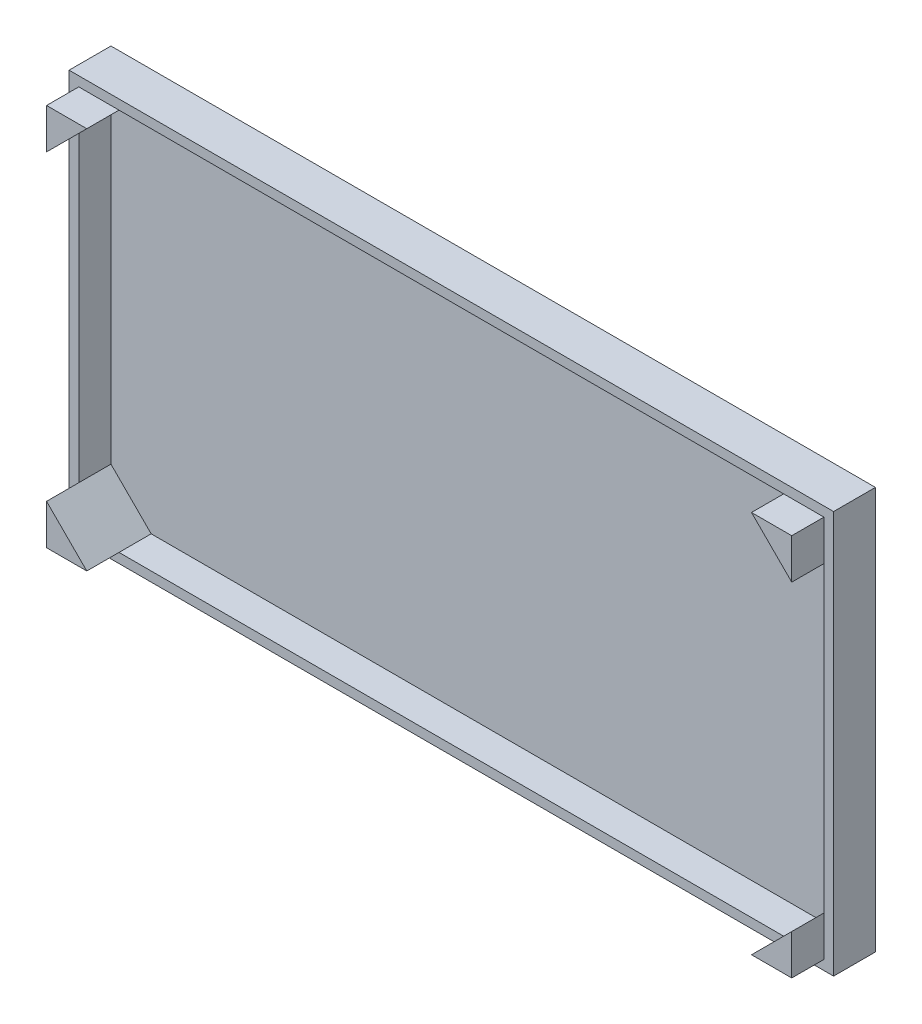
ISO-10303-21;
HEADER;
FILE_DESCRIPTION(('STEP AP214'),'2;1');
FILE_NAME('part.step','',(''),(''),'','','');
FILE_SCHEMA(('AUTOMOTIVE_DESIGN { 1 0 10303 214 1 1 1 1 }'));
ENDSEC;
DATA;
#1=APPLICATION_CONTEXT('core data for automotive mechanical design processes');
#2=APPLICATION_PROTOCOL_DEFINITION('international standard','automotive_design',2000,#1);
#3=PRODUCT_CONTEXT('',#1,'mechanical');
#4=PRODUCT('Part','Part','',(#3));
#5=PRODUCT_RELATED_PRODUCT_CATEGORY('part','',(#4));
#6=PRODUCT_DEFINITION_FORMATION('','',#4);
#7=PRODUCT_DEFINITION_CONTEXT('part definition',#1,'design');
#8=PRODUCT_DEFINITION('design','',#6,#7);
#9=PRODUCT_DEFINITION_SHAPE('','',#8);
#10=(LENGTH_UNIT() NAMED_UNIT(*) SI_UNIT(.MILLI.,.METRE.));
#11=(NAMED_UNIT(*) PLANE_ANGLE_UNIT() SI_UNIT($,.RADIAN.));
#12=(NAMED_UNIT(*) SI_UNIT($,.STERADIAN.) SOLID_ANGLE_UNIT());
#13=UNCERTAINTY_MEASURE_WITH_UNIT(LENGTH_MEASURE(1.E-05),#10,'distance_accuracy_value','');
#14=(GEOMETRIC_REPRESENTATION_CONTEXT(3) GLOBAL_UNCERTAINTY_ASSIGNED_CONTEXT((#13)) GLOBAL_UNIT_ASSIGNED_CONTEXT((#10,
#11,#12)) REPRESENTATION_CONTEXT('',''));
#15=CARTESIAN_POINT('',(0.,0.,0.));
#16=DIRECTION('',(0.,0.,1.));
#17=DIRECTION('',(1.,0.,0.));
#18=AXIS2_PLACEMENT_3D('',#15,#16,#17);
#19=CARTESIAN_POINT('',(0.,0.,1.2));
#20=DIRECTION('',(0.,0.,-1.));
#21=DIRECTION('',(-1.,0.,0.));
#22=AXIS2_PLACEMENT_3D('',#19,#20,#21);
#23=PLANE('',#22);
#24=DIRECTION('',(-0.707106781186548,0.707106781186547,0.));
#25=VECTOR('',#24,1.);
#26=CARTESIAN_POINT('',(1.2,6.2,1.2));
#27=LINE('',#26,#25);
#28=CARTESIAN_POINT('',(6.20000000000001,1.2,1.2));
#29=VERTEX_POINT('',#28);
#30=CARTESIAN_POINT('',(1.20000000000001,6.2,1.2));
#31=VERTEX_POINT('',#30);
#32=EDGE_CURVE('E48',#29,#31,#27,.T.);
#33=ORIENTED_EDGE('',*,*,#32,.F.);
#34=DIRECTION('',(1.,0.,0.));
#35=VECTOR('',#34,1.);
#36=CARTESIAN_POINT('',(1.20000000000001,1.2,1.2));
#37=LINE('',#36,#35);
#38=CARTESIAN_POINT('',(88.8,1.2,1.2));
#39=VERTEX_POINT('',#38);
#40=EDGE_CURVE('E281',#29,#39,#37,.T.);
#41=ORIENTED_EDGE('',*,*,#40,.T.);
#42=DIRECTION('',(-0.707106781186548,-0.707106781186547,0.));
#43=VECTOR('',#42,1.);
#44=CARTESIAN_POINT('',(88.8,1.2,1.2));
#45=LINE('',#44,#43);
#46=CARTESIAN_POINT('',(93.8,6.2,1.2));
#47=VERTEX_POINT('',#46);
#48=EDGE_CURVE('E194',#47,#39,#45,.T.);
#49=ORIENTED_EDGE('',*,*,#48,.F.);
#50=DIRECTION('',(0.,1.,0.));
#51=VECTOR('',#50,1.);
#52=CARTESIAN_POINT('',(93.8,48.8,1.2));
#53=LINE('',#52,#51);
#54=CARTESIAN_POINT('',(93.8,43.8,1.2));
#55=VERTEX_POINT('',#54);
#56=EDGE_CURVE('E283',#47,#55,#53,.T.);
#57=ORIENTED_EDGE('',*,*,#56,.T.);
#58=DIRECTION('',(0.707106781186548,-0.707106781186547,0.));
#59=VECTOR('',#58,1.);
#60=CARTESIAN_POINT('',(93.8,43.8,1.2));
#61=LINE('',#60,#59);
#62=CARTESIAN_POINT('',(88.8,48.8,1.2));
#63=VERTEX_POINT('',#62);
#64=EDGE_CURVE('E219',#63,#55,#61,.T.);
#65=ORIENTED_EDGE('',*,*,#64,.F.);
#66=DIRECTION('',(-1.,0.,0.));
#67=VECTOR('',#66,1.);
#68=CARTESIAN_POINT('',(1.2,48.8,1.2));
#69=LINE('',#68,#67);
#70=CARTESIAN_POINT('',(6.2,48.8,1.2));
#71=VERTEX_POINT('',#70);
#72=EDGE_CURVE('E285',#63,#71,#69,.T.);
#73=ORIENTED_EDGE('',*,*,#72,.T.);
#74=DIRECTION('',(0.707106781186548,0.707106781186547,0.));
#75=VECTOR('',#74,1.);
#76=CARTESIAN_POINT('',(6.2,48.8,1.2));
#77=LINE('',#76,#75);
#78=CARTESIAN_POINT('',(1.20000000000001,43.8,1.2));
#79=VERTEX_POINT('',#78);
#80=EDGE_CURVE('E239',#79,#71,#77,.T.);
#81=ORIENTED_EDGE('',*,*,#80,.F.);
#82=DIRECTION('',(0.,-1.,0.));
#83=VECTOR('',#82,1.);
#84=CARTESIAN_POINT('',(1.2,48.8,1.2));
#85=LINE('',#84,#83);
#86=EDGE_CURVE('E263',#79,#31,#85,.T.);
#87=ORIENTED_EDGE('',*,*,#86,.T.);
#88=EDGE_LOOP('',(#33,#41,#49,#57,#65,#73,#81,#87));
#89=FACE_BOUND('',#88,.T.);
#90=ADVANCED_FACE('F33',(#89),#23,.F.);
#91=CARTESIAN_POINT('',(1.20000000000001,1.2,5.2));
#92=DIRECTION('',(0.,1.,0.));
#93=DIRECTION('',(0.,0.,1.));
#94=AXIS2_PLACEMENT_3D('',#91,#92,#93);
#95=PLANE('',#94);
#96=ORIENTED_EDGE('',*,*,#40,.F.);
#97=DIRECTION('',(0.,0.,-1.));
#98=VECTOR('',#97,1.);
#99=CARTESIAN_POINT('',(6.20000000000001,1.2,9.2));
#100=LINE('',#99,#98);
#101=CARTESIAN_POINT('',(6.2,1.2,5.2));
#102=VERTEX_POINT('',#101);
#103=EDGE_CURVE('E195',#102,#29,#100,.T.);
#104=ORIENTED_EDGE('',*,*,#103,.F.);
#105=DIRECTION('',(1.,0.,0.));
#106=VECTOR('',#105,1.);
#107=CARTESIAN_POINT('',(1.20000000000001,1.2,5.2));
#108=LINE('',#107,#106);
#109=CARTESIAN_POINT('',(88.8,1.2,5.2));
#110=VERTEX_POINT('',#109);
#111=EDGE_CURVE('E272',#102,#110,#108,.T.);
#112=ORIENTED_EDGE('',*,*,#111,.T.);
#113=DIRECTION('',(0.,0.,-1.));
#114=VECTOR('',#113,1.);
#115=CARTESIAN_POINT('',(88.8,1.2,5.2));
#116=LINE('',#115,#114);
#117=EDGE_CURVE('E11',#110,#39,#116,.T.);
#118=ORIENTED_EDGE('',*,*,#117,.T.);
#119=EDGE_LOOP('',(#96,#104,#112,#118));
#120=FACE_BOUND('',#119,.T.);
#121=ADVANCED_FACE('F355',(#120),#95,.T.);
#122=CARTESIAN_POINT('',(1.2,48.8,5.2));
#123=DIRECTION('',(1.,0.,0.));
#124=DIRECTION('',(0.,1.,0.));
#125=AXIS2_PLACEMENT_3D('',#122,#123,#124);
#126=PLANE('',#125);
#127=DIRECTION('',(0.,-1.,0.));
#128=VECTOR('',#127,1.);
#129=CARTESIAN_POINT('',(1.2,48.8,5.2));
#130=LINE('',#129,#128);
#131=CARTESIAN_POINT('',(1.2,43.8,5.2));
#132=VERTEX_POINT('',#131);
#133=CARTESIAN_POINT('',(1.20000000000001,6.2,5.2));
#134=VERTEX_POINT('',#133);
#135=EDGE_CURVE('E268',#132,#134,#130,.T.);
#136=ORIENTED_EDGE('',*,*,#135,.T.);
#137=DIRECTION('',(0.,0.,-1.));
#138=VECTOR('',#137,1.);
#139=CARTESIAN_POINT('',(1.2,6.2,9.2));
#140=LINE('',#139,#138);
#141=EDGE_CURVE('E56',#134,#31,#140,.T.);
#142=ORIENTED_EDGE('',*,*,#141,.T.);
#143=ORIENTED_EDGE('',*,*,#86,.F.);
#144=DIRECTION('',(0.,0.,-1.));
#145=VECTOR('',#144,1.);
#146=CARTESIAN_POINT('',(1.2,43.8,9.2));
#147=LINE('',#146,#145);
#148=EDGE_CURVE('E256',#132,#79,#147,.T.);
#149=ORIENTED_EDGE('',*,*,#148,.F.);
#150=EDGE_LOOP('',(#136,#142,#143,#149));
#151=FACE_BOUND('',#150,.T.);
#152=ADVANCED_FACE('F381',(#151),#126,.T.);
#153=CARTESIAN_POINT('',(93.8,48.8,5.2));
#154=DIRECTION('',(-1.,0.,0.));
#155=DIRECTION('',(0.,0.,1.));
#156=AXIS2_PLACEMENT_3D('',#153,#154,#155);
#157=PLANE('',#156);
#158=ORIENTED_EDGE('',*,*,#56,.F.);
#159=DIRECTION('',(0.,0.,-1.));
#160=VECTOR('',#159,1.);
#161=CARTESIAN_POINT('',(93.8,6.2,9.2));
#162=LINE('',#161,#160);
#163=CARTESIAN_POINT('',(93.8,6.2,5.2));
#164=VERTEX_POINT('',#163);
#165=EDGE_CURVE('E215',#164,#47,#162,.T.);
#166=ORIENTED_EDGE('',*,*,#165,.F.);
#167=DIRECTION('',(0.,1.,0.));
#168=VECTOR('',#167,1.);
#169=CARTESIAN_POINT('',(93.8,48.8,5.2));
#170=LINE('',#169,#168);
#171=CARTESIAN_POINT('',(93.8,43.8,5.2));
#172=VERTEX_POINT('',#171);
#173=EDGE_CURVE('E276',#164,#172,#170,.T.);
#174=ORIENTED_EDGE('',*,*,#173,.T.);
#175=DIRECTION('',(0.,0.,-1.));
#176=VECTOR('',#175,1.);
#177=CARTESIAN_POINT('',(93.8,43.8,5.2));
#178=LINE('',#177,#176);
#179=EDGE_CURVE('E41',#172,#55,#178,.T.);
#180=ORIENTED_EDGE('',*,*,#179,.T.);
#181=EDGE_LOOP('',(#158,#166,#174,#180));
#182=FACE_BOUND('',#181,.T.);
#183=ADVANCED_FACE('F322',(#182),#157,.T.);
#184=CARTESIAN_POINT('',(1.2,48.8,5.2));
#185=DIRECTION('',(0.,-1.,0.));
#186=DIRECTION('',(0.,0.,-1.));
#187=AXIS2_PLACEMENT_3D('',#184,#185,#186);
#188=PLANE('',#187);
#189=ORIENTED_EDGE('',*,*,#72,.F.);
#190=DIRECTION('',(0.,0.,-1.));
#191=VECTOR('',#190,1.);
#192=CARTESIAN_POINT('',(88.8,48.8,9.2));
#193=LINE('',#192,#191);
#194=CARTESIAN_POINT('',(88.8,48.8,5.2));
#195=VERTEX_POINT('',#194);
#196=EDGE_CURVE('E235',#195,#63,#193,.T.);
#197=ORIENTED_EDGE('',*,*,#196,.F.);
#198=DIRECTION('',(-1.,0.,0.));
#199=VECTOR('',#198,1.);
#200=CARTESIAN_POINT('',(1.2,48.8,5.2));
#201=LINE('',#200,#199);
#202=CARTESIAN_POINT('',(6.2,48.8,5.2));
#203=VERTEX_POINT('',#202);
#204=EDGE_CURVE('E275',#195,#203,#201,.T.);
#205=ORIENTED_EDGE('',*,*,#204,.T.);
#206=DIRECTION('',(0.,0.,-1.));
#207=VECTOR('',#206,1.);
#208=CARTESIAN_POINT('',(6.2,48.8,9.2));
#209=LINE('',#208,#207);
#210=EDGE_CURVE('E252',#203,#71,#209,.T.);
#211=ORIENTED_EDGE('',*,*,#210,.T.);
#212=EDGE_LOOP('',(#189,#197,#205,#211));
#213=FACE_BOUND('',#212,.T.);
#214=ADVANCED_FACE('F346',(#213),#188,.T.);
#215=CARTESIAN_POINT('',(0.,0.,1.2));
#216=DIRECTION('',(1.,0.,0.));
#217=DIRECTION('',(0.,0.,-1.));
#218=AXIS2_PLACEMENT_3D('',#215,#216,#217);
#219=PLANE('',#218);
#220=DIRECTION('',(0.,-1.,0.));
#221=VECTOR('',#220,1.);
#222=CARTESIAN_POINT('',(0.,0.,0.));
#223=LINE('',#222,#221);
#224=CARTESIAN_POINT('',(0.,50.,0.));
#225=VERTEX_POINT('',#224);
#226=CARTESIAN_POINT('',(0.,0.,0.));
#227=VERTEX_POINT('',#226);
#228=EDGE_CURVE('E298',#225,#227,#223,.T.);
#229=ORIENTED_EDGE('',*,*,#228,.T.);
#230=DIRECTION('',(0.,0.,-1.));
#231=VECTOR('',#230,1.);
#232=CARTESIAN_POINT('',(0.,0.,1.2));
#233=LINE('',#232,#231);
#234=CARTESIAN_POINT('',(0.,0.,5.2));
#235=VERTEX_POINT('',#234);
#236=EDGE_CURVE('E316',#235,#227,#233,.T.);
#237=ORIENTED_EDGE('',*,*,#236,.F.);
#238=DIRECTION('',(0.,-1.,0.));
#239=VECTOR('',#238,1.);
#240=CARTESIAN_POINT('',(0.,50.,5.2));
#241=LINE('',#240,#239);
#242=CARTESIAN_POINT('',(0.,50.,5.2));
#243=VERTEX_POINT('',#242);
#244=EDGE_CURVE('E279',#243,#235,#241,.T.);
#245=ORIENTED_EDGE('',*,*,#244,.F.);
#246=DIRECTION('',(0.,0.,-1.));
#247=VECTOR('',#246,1.);
#248=CARTESIAN_POINT('',(0.,50.,1.2));
#249=LINE('',#248,#247);
#250=EDGE_CURVE('E307',#243,#225,#249,.T.);
#251=ORIENTED_EDGE('',*,*,#250,.T.);
#252=EDGE_LOOP('',(#229,#237,#245,#251));
#253=FACE_BOUND('',#252,.T.);
#254=ADVANCED_FACE('F35',(#253),#219,.F.);
#255=CARTESIAN_POINT('',(0.,0.,1.2));
#256=DIRECTION('',(0.,1.,0.));
#257=DIRECTION('',(0.,0.,1.));
#258=AXIS2_PLACEMENT_3D('',#255,#256,#257);
#259=PLANE('',#258);
#260=DIRECTION('',(1.,0.,0.));
#261=VECTOR('',#260,1.);
#262=CARTESIAN_POINT('',(0.,0.,0.));
#263=LINE('',#262,#261);
#264=CARTESIAN_POINT('',(95.,0.,0.));
#265=VERTEX_POINT('',#264);
#266=EDGE_CURVE('E301',#227,#265,#263,.T.);
#267=ORIENTED_EDGE('',*,*,#266,.T.);
#268=DIRECTION('',(0.,0.,-1.));
#269=VECTOR('',#268,1.);
#270=CARTESIAN_POINT('',(95.,0.,1.2));
#271=LINE('',#270,#269);
#272=CARTESIAN_POINT('',(95.,0.,5.2));
#273=VERTEX_POINT('',#272);
#274=EDGE_CURVE('E313',#273,#265,#271,.T.);
#275=ORIENTED_EDGE('',*,*,#274,.F.);
#276=DIRECTION('',(1.,0.,0.));
#277=VECTOR('',#276,1.);
#278=CARTESIAN_POINT('',(0.,0.,5.2));
#279=LINE('',#278,#277);
#280=EDGE_CURVE('E289',#235,#273,#279,.T.);
#281=ORIENTED_EDGE('',*,*,#280,.F.);
#282=ORIENTED_EDGE('',*,*,#236,.T.);
#283=EDGE_LOOP('',(#267,#275,#281,#282));
#284=FACE_BOUND('',#283,.T.);
#285=ADVANCED_FACE('F396',(#284),#259,.F.);
#286=CARTESIAN_POINT('',(95.,0.,1.2));
#287=DIRECTION('',(-1.,0.,0.));
#288=DIRECTION('',(0.,0.,1.));
#289=AXIS2_PLACEMENT_3D('',#286,#287,#288);
#290=PLANE('',#289);
#291=DIRECTION('',(0.,1.,0.));
#292=VECTOR('',#291,1.);
#293=CARTESIAN_POINT('',(95.,0.,0.));
#294=LINE('',#293,#292);
#295=CARTESIAN_POINT('',(95.,50.,0.));
#296=VERTEX_POINT('',#295);
#297=EDGE_CURVE('E303',#265,#296,#294,.T.);
#298=ORIENTED_EDGE('',*,*,#297,.T.);
#299=DIRECTION('',(0.,0.,-1.));
#300=VECTOR('',#299,1.);
#301=CARTESIAN_POINT('',(95.,50.,1.2));
#302=LINE('',#301,#300);
#303=CARTESIAN_POINT('',(95.,50.,5.2));
#304=VERTEX_POINT('',#303);
#305=EDGE_CURVE('E310',#304,#296,#302,.T.);
#306=ORIENTED_EDGE('',*,*,#305,.F.);
#307=DIRECTION('',(0.,1.,0.));
#308=VECTOR('',#307,1.);
#309=CARTESIAN_POINT('',(95.,50.,5.2));
#310=LINE('',#309,#308);
#311=EDGE_CURVE('E292',#273,#304,#310,.T.);
#312=ORIENTED_EDGE('',*,*,#311,.F.);
#313=ORIENTED_EDGE('',*,*,#274,.T.);
#314=EDGE_LOOP('',(#298,#306,#312,#313));
#315=FACE_BOUND('',#314,.T.);
#316=ADVANCED_FACE('F393',(#315),#290,.F.);
#317=CARTESIAN_POINT('',(0.,50.,1.2));
#318=DIRECTION('',(0.,-1.,0.));
#319=DIRECTION('',(0.,0.,-1.));
#320=AXIS2_PLACEMENT_3D('',#317,#318,#319);
#321=PLANE('',#320);
#322=DIRECTION('',(-1.,0.,0.));
#323=VECTOR('',#322,1.);
#324=CARTESIAN_POINT('',(0.,50.,0.));
#325=LINE('',#324,#323);
#326=EDGE_CURVE('E305',#296,#225,#325,.T.);
#327=ORIENTED_EDGE('',*,*,#326,.T.);
#328=ORIENTED_EDGE('',*,*,#250,.F.);
#329=DIRECTION('',(-1.,0.,0.));
#330=VECTOR('',#329,1.);
#331=CARTESIAN_POINT('',(0.,50.,5.2));
#332=LINE('',#331,#330);
#333=EDGE_CURVE('E295',#304,#243,#332,.T.);
#334=ORIENTED_EDGE('',*,*,#333,.F.);
#335=ORIENTED_EDGE('',*,*,#305,.T.);
#336=EDGE_LOOP('',(#327,#328,#334,#335));
#337=FACE_BOUND('',#336,.T.);
#338=ADVANCED_FACE('F389',(#337),#321,.F.);
#339=CARTESIAN_POINT('',(0.,0.,0.));
#340=DIRECTION('',(0.,0.,-1.));
#341=DIRECTION('',(-1.,0.,0.));
#342=AXIS2_PLACEMENT_3D('',#339,#340,#341);
#343=PLANE('',#342);
#344=ORIENTED_EDGE('',*,*,#228,.F.);
#345=ORIENTED_EDGE('',*,*,#326,.F.);
#346=ORIENTED_EDGE('',*,*,#297,.F.);
#347=ORIENTED_EDGE('',*,*,#266,.F.);
#348=EDGE_LOOP('',(#344,#345,#346,#347));
#349=FACE_BOUND('',#348,.T.);
#350=ADVANCED_FACE('F386',(#349),#343,.T.);
#351=CARTESIAN_POINT('',(0.,0.,5.2));
#352=DIRECTION('',(0.,0.,1.));
#353=DIRECTION('',(1.,0.,0.));
#354=AXIS2_PLACEMENT_3D('',#351,#352,#353);
#355=PLANE('',#354);
#356=ORIENTED_EDGE('',*,*,#244,.T.);
#357=ORIENTED_EDGE('',*,*,#280,.T.);
#358=ORIENTED_EDGE('',*,*,#311,.T.);
#359=ORIENTED_EDGE('',*,*,#333,.T.);
#360=EDGE_LOOP('',(#356,#357,#358,#359));
#361=FACE_BOUND('',#360,.T.);
#362=CARTESIAN_POINT('',(1.20000000000001,1.2,5.2));
#363=VERTEX_POINT('',#362);
#364=EDGE_CURVE('E193',#363,#102,#108,.T.);
#365=ORIENTED_EDGE('',*,*,#364,.F.);
#366=EDGE_CURVE('E269',#134,#363,#130,.T.);
#367=ORIENTED_EDGE('',*,*,#366,.F.);
#368=ORIENTED_EDGE('',*,*,#135,.F.);
#369=CARTESIAN_POINT('',(1.2,48.8,5.2));
#370=VERTEX_POINT('',#369);
#371=EDGE_CURVE('E264',#370,#132,#130,.T.);
#372=ORIENTED_EDGE('',*,*,#371,.F.);
#373=DIRECTION('',(1.,0.,0.));
#374=VECTOR('',#373,1.);
#375=CARTESIAN_POINT('',(0.,48.8,5.2));
#376=LINE('',#375,#374);
#377=EDGE_CURVE('E260',#370,#203,#376,.T.);
#378=ORIENTED_EDGE('',*,*,#377,.T.);
#379=ORIENTED_EDGE('',*,*,#204,.F.);
#380=CARTESIAN_POINT('',(93.8,48.8,5.2));
#381=VERTEX_POINT('',#380);
#382=EDGE_CURVE('E277',#381,#195,#201,.T.);
#383=ORIENTED_EDGE('',*,*,#382,.F.);
#384=EDGE_CURVE('E271',#172,#381,#170,.T.);
#385=ORIENTED_EDGE('',*,*,#384,.F.);
#386=ORIENTED_EDGE('',*,*,#173,.F.);
#387=CARTESIAN_POINT('',(93.8,1.2,5.2));
#388=VERTEX_POINT('',#387);
#389=EDGE_CURVE('E273',#388,#164,#170,.T.);
#390=ORIENTED_EDGE('',*,*,#389,.F.);
#391=EDGE_CURVE('E267',#110,#388,#108,.T.);
#392=ORIENTED_EDGE('',*,*,#391,.F.);
#393=ORIENTED_EDGE('',*,*,#111,.F.);
#394=EDGE_LOOP('',(#365,#367,#368,#372,#378,#379,#383,#385,#386,#390,#392,#393));
#395=FACE_BOUND('',#394,.T.);
#396=ADVANCED_FACE('F336',(#361,#395),#355,.T.);
#397=CARTESIAN_POINT('',(1.2,43.8,9.2));
#398=DIRECTION('',(1.,0.,0.));
#399=DIRECTION('',(0.,1.,0.));
#400=AXIS2_PLACEMENT_3D('',#397,#398,#399);
#401=PLANE('',#400);
#402=ORIENTED_EDGE('',*,*,#371,.T.);
#403=CARTESIAN_POINT('',(1.2,43.8,9.2));
#404=VERTEX_POINT('',#403);
#405=EDGE_CURVE('E257',#404,#132,#147,.T.);
#406=ORIENTED_EDGE('',*,*,#405,.F.);
#407=DIRECTION('',(0.,-1.,0.));
#408=VECTOR('',#407,1.);
#409=CARTESIAN_POINT('',(1.2,43.8,9.2));
#410=LINE('',#409,#408);
#411=CARTESIAN_POINT('',(1.2,48.8,9.2));
#412=VERTEX_POINT('',#411);
#413=EDGE_CURVE('E240',#412,#404,#410,.T.);
#414=ORIENTED_EDGE('',*,*,#413,.F.);
#415=DIRECTION('',(0.,0.,-1.));
#416=VECTOR('',#415,1.);
#417=CARTESIAN_POINT('',(1.2,48.8,9.2));
#418=LINE('',#417,#416);
#419=EDGE_CURVE('E247',#412,#370,#418,.T.);
#420=ORIENTED_EDGE('',*,*,#419,.T.);
#421=EDGE_LOOP('',(#402,#406,#414,#420));
#422=FACE_BOUND('',#421,.T.);
#423=ADVANCED_FACE('F413',(#422),#401,.F.);
#424=CARTESIAN_POINT('',(6.2,48.8,9.2));
#425=DIRECTION('',(-0.707106781186547,0.707106781186548,0.));
#426=DIRECTION('',(-0.707106781186548,-0.707106781186547,0.));
#427=AXIS2_PLACEMENT_3D('',#424,#425,#426);
#428=PLANE('',#427);
#429=ORIENTED_EDGE('',*,*,#80,.T.);
#430=ORIENTED_EDGE('',*,*,#210,.F.);
#431=CARTESIAN_POINT('',(6.2,48.8,9.2));
#432=VERTEX_POINT('',#431);
#433=EDGE_CURVE('E253',#432,#203,#209,.T.);
#434=ORIENTED_EDGE('',*,*,#433,.F.);
#435=DIRECTION('',(0.707106781186548,0.707106781186547,0.));
#436=VECTOR('',#435,1.);
#437=CARTESIAN_POINT('',(6.2,48.8,9.2));
#438=LINE('',#437,#436);
#439=EDGE_CURVE('E243',#404,#432,#438,.T.);
#440=ORIENTED_EDGE('',*,*,#439,.F.);
#441=ORIENTED_EDGE('',*,*,#405,.T.);
#442=ORIENTED_EDGE('',*,*,#148,.T.);
#443=EDGE_LOOP('',(#429,#430,#434,#440,#441,#442));
#444=FACE_BOUND('',#443,.T.);
#445=ADVANCED_FACE('F417',(#444),#428,.F.);
#446=CARTESIAN_POINT('',(1.2,48.8,9.2));
#447=DIRECTION('',(0.,-1.,0.));
#448=DIRECTION('',(0.,0.,-1.));
#449=AXIS2_PLACEMENT_3D('',#446,#447,#448);
#450=PLANE('',#449);
#451=ORIENTED_EDGE('',*,*,#377,.F.);
#452=ORIENTED_EDGE('',*,*,#419,.F.);
#453=DIRECTION('',(-1.,0.,0.));
#454=VECTOR('',#453,1.);
#455=CARTESIAN_POINT('',(1.2,48.8,9.2));
#456=LINE('',#455,#454);
#457=EDGE_CURVE('E245',#432,#412,#456,.T.);
#458=ORIENTED_EDGE('',*,*,#457,.F.);
#459=ORIENTED_EDGE('',*,*,#433,.T.);
#460=EDGE_LOOP('',(#451,#452,#458,#459));
#461=FACE_BOUND('',#460,.T.);
#462=ADVANCED_FACE('F423',(#461),#450,.F.);
#463=CARTESIAN_POINT('',(0.,0.,9.2));
#464=DIRECTION('',(0.,0.,-1.));
#465=DIRECTION('',(-1.,0.,0.));
#466=AXIS2_PLACEMENT_3D('',#463,#464,#465);
#467=PLANE('',#466);
#468=ORIENTED_EDGE('',*,*,#413,.T.);
#469=ORIENTED_EDGE('',*,*,#439,.T.);
#470=ORIENTED_EDGE('',*,*,#457,.T.);
#471=EDGE_LOOP('',(#468,#469,#470));
#472=FACE_BOUND('',#471,.T.);
#473=ADVANCED_FACE('F517',(#472),#467,.F.);
#474=CARTESIAN_POINT('',(88.8,48.8,9.2));
#475=DIRECTION('',(0.,-1.,0.));
#476=DIRECTION('',(0.,0.,-1.));
#477=AXIS2_PLACEMENT_3D('',#474,#475,#476);
#478=PLANE('',#477);
#479=ORIENTED_EDGE('',*,*,#382,.T.);
#480=CARTESIAN_POINT('',(88.8,48.8,9.2));
#481=VERTEX_POINT('',#480);
#482=EDGE_CURVE('E236',#481,#195,#193,.T.);
#483=ORIENTED_EDGE('',*,*,#482,.F.);
#484=DIRECTION('',(-1.,0.,0.));
#485=VECTOR('',#484,1.);
#486=CARTESIAN_POINT('',(88.8,48.8,9.2));
#487=LINE('',#486,#485);
#488=CARTESIAN_POINT('',(93.8,48.8,9.2));
#489=VERTEX_POINT('',#488);
#490=EDGE_CURVE('E220',#489,#481,#487,.T.);
#491=ORIENTED_EDGE('',*,*,#490,.F.);
#492=DIRECTION('',(0.,0.,-1.));
#493=VECTOR('',#492,1.);
#494=CARTESIAN_POINT('',(93.8,48.8,9.2));
#495=LINE('',#494,#493);
#496=EDGE_CURVE('E227',#489,#381,#495,.T.);
#497=ORIENTED_EDGE('',*,*,#496,.T.);
#498=EDGE_LOOP('',(#479,#483,#491,#497));
#499=FACE_BOUND('',#498,.T.);
#500=ADVANCED_FACE('F341',(#499),#478,.F.);
#501=CARTESIAN_POINT('',(93.8,43.8,9.2));
#502=DIRECTION('',(0.707106781186547,0.707106781186548,0.));
#503=DIRECTION('',(-0.707106781186548,0.707106781186547,0.));
#504=AXIS2_PLACEMENT_3D('',#501,#502,#503);
#505=PLANE('',#504);
#506=ORIENTED_EDGE('',*,*,#64,.T.);
#507=ORIENTED_EDGE('',*,*,#179,.F.);
#508=DIRECTION('',(0.,0.,-1.));
#509=VECTOR('',#508,1.);
#510=CARTESIAN_POINT('',(93.8,43.8,9.2));
#511=LINE('',#510,#509);
#512=CARTESIAN_POINT('',(93.8,43.8,9.2));
#513=VERTEX_POINT('',#512);
#514=EDGE_CURVE('E232',#513,#172,#511,.T.);
#515=ORIENTED_EDGE('',*,*,#514,.F.);
#516=DIRECTION('',(0.707106781186548,-0.707106781186547,0.));
#517=VECTOR('',#516,1.);
#518=CARTESIAN_POINT('',(93.8,43.8,9.2));
#519=LINE('',#518,#517);
#520=EDGE_CURVE('E223',#481,#513,#519,.T.);
#521=ORIENTED_EDGE('',*,*,#520,.F.);
#522=ORIENTED_EDGE('',*,*,#482,.T.);
#523=ORIENTED_EDGE('',*,*,#196,.T.);
#524=EDGE_LOOP('',(#506,#507,#515,#521,#522,#523));
#525=FACE_BOUND('',#524,.T.);
#526=ADVANCED_FACE('F327',(#525),#505,.F.);
#527=CARTESIAN_POINT('',(93.8,48.8,9.2));
#528=DIRECTION('',(-1.,0.,0.));
#529=DIRECTION('',(0.,0.,1.));
#530=AXIS2_PLACEMENT_3D('',#527,#528,#529);
#531=PLANE('',#530);
#532=ORIENTED_EDGE('',*,*,#384,.T.);
#533=ORIENTED_EDGE('',*,*,#496,.F.);
#534=DIRECTION('',(0.,1.,0.));
#535=VECTOR('',#534,1.);
#536=CARTESIAN_POINT('',(93.8,48.8,9.2));
#537=LINE('',#536,#535);
#538=EDGE_CURVE('E225',#513,#489,#537,.T.);
#539=ORIENTED_EDGE('',*,*,#538,.F.);
#540=ORIENTED_EDGE('',*,*,#514,.T.);
#541=EDGE_LOOP('',(#532,#533,#539,#540));
#542=FACE_BOUND('',#541,.T.);
#543=ADVANCED_FACE('F332',(#542),#531,.F.);
#544=CARTESIAN_POINT('',(0.,0.,9.2));
#545=DIRECTION('',(0.,0.,-1.));
#546=DIRECTION('',(-1.,0.,0.));
#547=AXIS2_PLACEMENT_3D('',#544,#545,#546);
#548=PLANE('',#547);
#549=ORIENTED_EDGE('',*,*,#490,.T.);
#550=ORIENTED_EDGE('',*,*,#520,.T.);
#551=ORIENTED_EDGE('',*,*,#538,.T.);
#552=EDGE_LOOP('',(#549,#550,#551));
#553=FACE_BOUND('',#552,.T.);
#554=ADVANCED_FACE('F483',(#553),#548,.F.);
#555=CARTESIAN_POINT('',(93.8,6.2,9.2));
#556=DIRECTION('',(-1.,0.,0.));
#557=DIRECTION('',(0.,0.,1.));
#558=AXIS2_PLACEMENT_3D('',#555,#556,#557);
#559=PLANE('',#558);
#560=ORIENTED_EDGE('',*,*,#389,.T.);
#561=CARTESIAN_POINT('',(93.8,6.2,9.2));
#562=VERTEX_POINT('',#561);
#563=EDGE_CURVE('E216',#562,#164,#162,.T.);
#564=ORIENTED_EDGE('',*,*,#563,.F.);
#565=DIRECTION('',(0.,1.,0.));
#566=VECTOR('',#565,1.);
#567=CARTESIAN_POINT('',(93.8,6.2,9.2));
#568=LINE('',#567,#566);
#569=CARTESIAN_POINT('',(93.8,1.2,9.2));
#570=VERTEX_POINT('',#569);
#571=EDGE_CURVE('E198',#570,#562,#568,.T.);
#572=ORIENTED_EDGE('',*,*,#571,.F.);
#573=DIRECTION('',(0.,0.,-1.));
#574=VECTOR('',#573,1.);
#575=CARTESIAN_POINT('',(93.8,1.2,9.2));
#576=LINE('',#575,#574);
#577=EDGE_CURVE('E208',#570,#388,#576,.T.);
#578=ORIENTED_EDGE('',*,*,#577,.T.);
#579=EDGE_LOOP('',(#560,#564,#572,#578));
#580=FACE_BOUND('',#579,.T.);
#581=ADVANCED_FACE('F364',(#580),#559,.F.);
#582=CARTESIAN_POINT('',(88.8,1.2,9.2));
#583=DIRECTION('',(0.707106781186547,-0.707106781186548,0.));
#584=DIRECTION('',(0.707106781186548,0.707106781186547,0.));
#585=AXIS2_PLACEMENT_3D('',#582,#583,#584);
#586=PLANE('',#585);
#587=ORIENTED_EDGE('',*,*,#48,.T.);
#588=ORIENTED_EDGE('',*,*,#117,.F.);
#589=DIRECTION('',(0.,0.,-1.));
#590=VECTOR('',#589,1.);
#591=CARTESIAN_POINT('',(88.8,1.2,9.2));
#592=LINE('',#591,#590);
#593=CARTESIAN_POINT('',(88.8,1.2,9.2));
#594=VERTEX_POINT('',#593);
#595=EDGE_CURVE('E212',#594,#110,#592,.T.);
#596=ORIENTED_EDGE('',*,*,#595,.F.);
#597=DIRECTION('',(-0.707106781186548,-0.707106781186547,0.));
#598=VECTOR('',#597,1.);
#599=CARTESIAN_POINT('',(88.8,1.2,9.2));
#600=LINE('',#599,#598);
#601=EDGE_CURVE('E205',#562,#594,#600,.T.);
#602=ORIENTED_EDGE('',*,*,#601,.F.);
#603=ORIENTED_EDGE('',*,*,#563,.T.);
#604=ORIENTED_EDGE('',*,*,#165,.T.);
#605=EDGE_LOOP('',(#587,#588,#596,#602,#603,#604));
#606=FACE_BOUND('',#605,.T.);
#607=ADVANCED_FACE('F352',(#606),#586,.F.);
#608=CARTESIAN_POINT('',(93.8,1.2,9.2));
#609=DIRECTION('',(0.,1.,0.));
#610=DIRECTION('',(-1.,0.,0.));
#611=AXIS2_PLACEMENT_3D('',#608,#609,#610);
#612=PLANE('',#611);
#613=ORIENTED_EDGE('',*,*,#391,.T.);
#614=ORIENTED_EDGE('',*,*,#577,.F.);
#615=DIRECTION('',(1.,0.,0.));
#616=VECTOR('',#615,1.);
#617=CARTESIAN_POINT('',(93.8,1.2,9.2));
#618=LINE('',#617,#616);
#619=EDGE_CURVE('E207',#594,#570,#618,.T.);
#620=ORIENTED_EDGE('',*,*,#619,.F.);
#621=ORIENTED_EDGE('',*,*,#595,.T.);
#622=EDGE_LOOP('',(#613,#614,#620,#621));
#623=FACE_BOUND('',#622,.T.);
#624=ADVANCED_FACE('F360',(#623),#612,.F.);
#625=CARTESIAN_POINT('',(0.,0.,9.2));
#626=DIRECTION('',(0.,0.,-1.));
#627=DIRECTION('',(-1.,0.,0.));
#628=AXIS2_PLACEMENT_3D('',#625,#626,#627);
#629=PLANE('',#628);
#630=ORIENTED_EDGE('',*,*,#571,.T.);
#631=ORIENTED_EDGE('',*,*,#601,.T.);
#632=ORIENTED_EDGE('',*,*,#619,.T.);
#633=EDGE_LOOP('',(#630,#631,#632));
#634=FACE_BOUND('',#633,.T.);
#635=ADVANCED_FACE('F367',(#634),#629,.F.);
#636=CARTESIAN_POINT('',(6.20000000000001,1.2,9.2));
#637=DIRECTION('',(0.,1.,0.));
#638=DIRECTION('',(0.,0.,1.));
#639=AXIS2_PLACEMENT_3D('',#636,#637,#638);
#640=PLANE('',#639);
#641=ORIENTED_EDGE('',*,*,#364,.T.);
#642=CARTESIAN_POINT('',(6.20000000000001,1.2,9.2));
#643=VERTEX_POINT('',#642);
#644=EDGE_CURVE('E177',#643,#102,#100,.T.);
#645=ORIENTED_EDGE('',*,*,#644,.F.);
#646=DIRECTION('',(1.,0.,0.));
#647=VECTOR('',#646,1.);
#648=CARTESIAN_POINT('',(6.20000000000001,1.2,9.2));
#649=LINE('',#648,#647);
#650=CARTESIAN_POINT('',(1.20000000000001,1.2,9.2));
#651=VERTEX_POINT('',#650);
#652=EDGE_CURVE('E183',#651,#643,#649,.T.);
#653=ORIENTED_EDGE('',*,*,#652,.F.);
#654=DIRECTION('',(0.,0.,-1.));
#655=VECTOR('',#654,1.);
#656=CARTESIAN_POINT('',(1.20000000000001,1.2,9.2));
#657=LINE('',#656,#655);
#658=EDGE_CURVE('E436',#651,#363,#657,.T.);
#659=ORIENTED_EDGE('',*,*,#658,.T.);
#660=EDGE_LOOP('',(#641,#645,#653,#659));
#661=FACE_BOUND('',#660,.T.);
#662=ADVANCED_FACE('F192',(#661),#640,.F.);
#663=CARTESIAN_POINT('',(1.2,6.2,9.2));
#664=DIRECTION('',(-0.707106781186547,-0.707106781186548,0.));
#665=DIRECTION('',(0.707106781186548,-0.707106781186547,0.));
#666=AXIS2_PLACEMENT_3D('',#663,#664,#665);
#667=PLANE('',#666);
#668=ORIENTED_EDGE('',*,*,#32,.T.);
#669=ORIENTED_EDGE('',*,*,#141,.F.);
#670=CARTESIAN_POINT('',(1.2,6.2,9.2));
#671=VERTEX_POINT('',#670);
#672=EDGE_CURVE('E179',#671,#134,#140,.T.);
#673=ORIENTED_EDGE('',*,*,#672,.F.);
#674=DIRECTION('',(-0.707106781186548,0.707106781186547,0.));
#675=VECTOR('',#674,1.);
#676=CARTESIAN_POINT('',(1.2,6.2,9.2));
#677=LINE('',#676,#675);
#678=EDGE_CURVE('E172',#643,#671,#677,.T.);
#679=ORIENTED_EDGE('',*,*,#678,.F.);
#680=ORIENTED_EDGE('',*,*,#644,.T.);
#681=ORIENTED_EDGE('',*,*,#103,.T.);
#682=EDGE_LOOP('',(#668,#669,#673,#679,#680,#681));
#683=FACE_BOUND('',#682,.T.);
#684=ADVANCED_FACE('F174',(#683),#667,.F.);
#685=CARTESIAN_POINT('',(1.20000000000001,1.2,9.2));
#686=DIRECTION('',(1.,0.,0.));
#687=DIRECTION('',(0.,1.,0.));
#688=AXIS2_PLACEMENT_3D('',#685,#686,#687);
#689=PLANE('',#688);
#690=ORIENTED_EDGE('',*,*,#366,.T.);
#691=ORIENTED_EDGE('',*,*,#658,.F.);
#692=DIRECTION('',(0.,-1.,0.));
#693=VECTOR('',#692,1.);
#694=CARTESIAN_POINT('',(1.20000000000001,1.2,9.2));
#695=LINE('',#694,#693);
#696=EDGE_CURVE('E182',#671,#651,#695,.T.);
#697=ORIENTED_EDGE('',*,*,#696,.F.);
#698=ORIENTED_EDGE('',*,*,#672,.T.);
#699=EDGE_LOOP('',(#690,#691,#697,#698));
#700=FACE_BOUND('',#699,.T.);
#701=ADVANCED_FACE('F439',(#700),#689,.F.);
#702=CARTESIAN_POINT('',(0.,0.,9.2));
#703=DIRECTION('',(0.,0.,-1.));
#704=DIRECTION('',(-1.,0.,0.));
#705=AXIS2_PLACEMENT_3D('',#702,#703,#704);
#706=PLANE('',#705);
#707=ORIENTED_EDGE('',*,*,#652,.T.);
#708=ORIENTED_EDGE('',*,*,#678,.T.);
#709=ORIENTED_EDGE('',*,*,#696,.T.);
#710=EDGE_LOOP('',(#707,#708,#709));
#711=FACE_BOUND('',#710,.T.);
#712=ADVANCED_FACE('F186',(#711),#706,.F.);
#713=CLOSED_SHELL('',(#90,#121,#152,#183,#214,#254,#285,#316,#338,#350,#396,#423,#445,#462,#473,
#500,#526,#543,#554,#581,#607,#624,#635,#662,#684,#701,#712));
#714=MANIFOLD_SOLID_BREP('B2',#713);
#715=ADVANCED_BREP_SHAPE_REPRESENTATION('',(#18,#714),#14);
#716=SHAPE_DEFINITION_REPRESENTATION(#9,#715);
ENDSEC;
END-ISO-10303-21;
